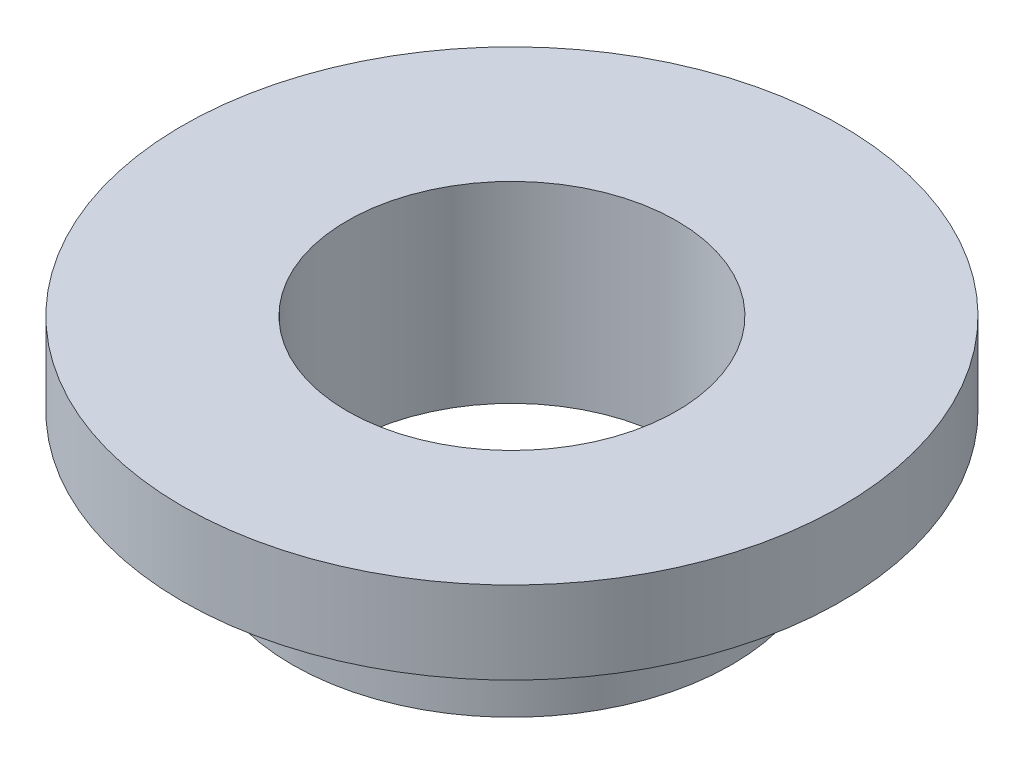
ISO-10303-21;
HEADER;
FILE_DESCRIPTION(('STEP AP214'),'2;1');
FILE_NAME('part.step','',(''),(''),'','','');
FILE_SCHEMA(('AUTOMOTIVE_DESIGN { 1 0 10303 214 1 1 1 1 }'));
ENDSEC;
DATA;
#1=APPLICATION_CONTEXT('core data for automotive mechanical design processes');
#2=APPLICATION_PROTOCOL_DEFINITION('international standard','automotive_design',2000,#1);
#3=PRODUCT_CONTEXT('',#1,'mechanical');
#4=PRODUCT('Part','Part','',(#3));
#5=PRODUCT_RELATED_PRODUCT_CATEGORY('part','',(#4));
#6=PRODUCT_DEFINITION_FORMATION('','',#4);
#7=PRODUCT_DEFINITION_CONTEXT('part definition',#1,'design');
#8=PRODUCT_DEFINITION('design','',#6,#7);
#9=PRODUCT_DEFINITION_SHAPE('','',#8);
#10=(LENGTH_UNIT() NAMED_UNIT(*) SI_UNIT(.MILLI.,.METRE.));
#11=(NAMED_UNIT(*) PLANE_ANGLE_UNIT() SI_UNIT($,.RADIAN.));
#12=(NAMED_UNIT(*) SI_UNIT($,.STERADIAN.) SOLID_ANGLE_UNIT());
#13=UNCERTAINTY_MEASURE_WITH_UNIT(LENGTH_MEASURE(1.E-05),#10,'distance_accuracy_value','');
#14=(GEOMETRIC_REPRESENTATION_CONTEXT(3) GLOBAL_UNCERTAINTY_ASSIGNED_CONTEXT((#13)) GLOBAL_UNIT_ASSIGNED_CONTEXT((#10,
#11,#12)) REPRESENTATION_CONTEXT('',''));
#15=CARTESIAN_POINT('',(0.,0.,0.));
#16=DIRECTION('',(0.,0.,1.));
#17=DIRECTION('',(1.,0.,0.));
#18=AXIS2_PLACEMENT_3D('',#15,#16,#17);
#19=CARTESIAN_POINT('',(0.,0.,0.));
#20=DIRECTION('',(0.,1.,0.));
#21=DIRECTION('',(0.,0.,1.));
#22=AXIS2_PLACEMENT_3D('',#19,#20,#21);
#23=PLANE('',#22);
#24=CARTESIAN_POINT('',(0.,0.,0.));
#25=DIRECTION('',(0.,1.,0.));
#26=DIRECTION('',(0.,0.,1.));
#27=AXIS2_PLACEMENT_3D('',#24,#25,#26);
#28=CIRCLE('',#27,8.);
#29=CARTESIAN_POINT('',(0.,0.,8.));
#30=VERTEX_POINT('',#29);
#31=EDGE_CURVE('E34',#30,#30,#28,.T.);
#32=ORIENTED_EDGE('',*,*,#31,.F.);
#33=EDGE_LOOP('',(#32));
#34=FACE_BOUND('',#33,.T.);
#35=CARTESIAN_POINT('',(0.,0.,0.));
#36=DIRECTION('',(0.,1.,0.));
#37=DIRECTION('',(0.,0.,1.));
#38=AXIS2_PLACEMENT_3D('',#35,#36,#37);
#39=CIRCLE('',#38,6.);
#40=CARTESIAN_POINT('',(0.,0.,6.));
#41=VERTEX_POINT('',#40);
#42=EDGE_CURVE('E41',#41,#41,#39,.T.);
#43=ORIENTED_EDGE('',*,*,#42,.T.);
#44=EDGE_LOOP('',(#43));
#45=FACE_BOUND('',#44,.T.);
#46=ADVANCED_FACE('F30',(#34,#45),#23,.F.);
#47=CARTESIAN_POINT('',(0.,4.,0.));
#48=DIRECTION('',(0.,-1.,0.));
#49=DIRECTION('',(0.,0.,-1.));
#50=AXIS2_PLACEMENT_3D('',#47,#48,#49);
#51=CYLINDRICAL_SURFACE('',#50,8.);
#52=CARTESIAN_POINT('',(0.,4.,0.));
#53=DIRECTION('',(0.,1.,0.));
#54=DIRECTION('',(0.,0.,1.));
#55=AXIS2_PLACEMENT_3D('',#52,#53,#54);
#56=CIRCLE('',#55,8.);
#57=CARTESIAN_POINT('',(0.,4.,8.));
#58=VERTEX_POINT('',#57);
#59=EDGE_CURVE('E10',#58,#58,#56,.T.);
#60=ORIENTED_EDGE('',*,*,#59,.F.);
#61=EDGE_LOOP('',(#60));
#62=FACE_BOUND('',#61,.T.);
#63=ORIENTED_EDGE('',*,*,#31,.T.);
#64=EDGE_LOOP('',(#63));
#65=FACE_BOUND('',#64,.T.);
#66=ADVANCED_FACE('F32',(#62,#65),#51,.T.);
#67=CARTESIAN_POINT('',(0.,4.,0.));
#68=DIRECTION('',(0.,-1.,0.));
#69=DIRECTION('',(0.,0.,-1.));
#70=AXIS2_PLACEMENT_3D('',#67,#68,#69);
#71=CYLINDRICAL_SURFACE('',#70,6.);
#72=ORIENTED_EDGE('',*,*,#42,.F.);
#73=EDGE_LOOP('',(#72));
#74=FACE_BOUND('',#73,.T.);
#75=CARTESIAN_POINT('',(0.,7.,0.));
#76=DIRECTION('',(0.,1.,0.));
#77=DIRECTION('',(0.,0.,1.));
#78=AXIS2_PLACEMENT_3D('',#75,#76,#77);
#79=CIRCLE('',#78,6.);
#80=CARTESIAN_POINT('',(0.,7.,6.));
#81=VERTEX_POINT('',#80);
#82=EDGE_CURVE('E49',#81,#81,#79,.T.);
#83=ORIENTED_EDGE('',*,*,#82,.T.);
#84=EDGE_LOOP('',(#83));
#85=FACE_BOUND('',#84,.T.);
#86=ADVANCED_FACE('F55',(#74,#85),#71,.F.);
#87=CARTESIAN_POINT('',(0.,4.,0.));
#88=DIRECTION('',(0.,1.,0.));
#89=DIRECTION('',(0.,0.,1.));
#90=AXIS2_PLACEMENT_3D('',#87,#88,#89);
#91=PLANE('',#90);
#92=CARTESIAN_POINT('',(0.,4.,0.));
#93=DIRECTION('',(0.,1.,0.));
#94=DIRECTION('',(0.,0.,1.));
#95=AXIS2_PLACEMENT_3D('',#92,#93,#94);
#96=CIRCLE('',#95,12.);
#97=CARTESIAN_POINT('',(0.,4.,12.));
#98=VERTEX_POINT('',#97);
#99=EDGE_CURVE('E46',#98,#98,#96,.T.);
#100=ORIENTED_EDGE('',*,*,#99,.F.);
#101=EDGE_LOOP('',(#100));
#102=FACE_BOUND('',#101,.T.);
#103=ORIENTED_EDGE('',*,*,#59,.T.);
#104=EDGE_LOOP('',(#103));
#105=FACE_BOUND('',#104,.T.);
#106=ADVANCED_FACE('F60',(#102,#105),#91,.F.);
#107=CARTESIAN_POINT('',(0.,7.,0.));
#108=DIRECTION('',(0.,1.,0.));
#109=DIRECTION('',(0.,0.,1.));
#110=AXIS2_PLACEMENT_3D('',#107,#108,#109);
#111=PLANE('',#110);
#112=CARTESIAN_POINT('',(0.,7.,0.));
#113=DIRECTION('',(0.,1.,0.));
#114=DIRECTION('',(0.,0.,1.));
#115=AXIS2_PLACEMENT_3D('',#112,#113,#114);
#116=CIRCLE('',#115,12.);
#117=CARTESIAN_POINT('',(0.,7.,12.));
#118=VERTEX_POINT('',#117);
#119=EDGE_CURVE('E45',#118,#118,#116,.T.);
#120=ORIENTED_EDGE('',*,*,#119,.T.);
#121=EDGE_LOOP('',(#120));
#122=FACE_BOUND('',#121,.T.);
#123=ORIENTED_EDGE('',*,*,#82,.F.);
#124=EDGE_LOOP('',(#123));
#125=FACE_BOUND('',#124,.T.);
#126=ADVANCED_FACE('F57',(#122,#125),#111,.T.);
#127=CARTESIAN_POINT('',(0.,7.,0.));
#128=DIRECTION('',(0.,-1.,0.));
#129=DIRECTION('',(0.,0.,-1.));
#130=AXIS2_PLACEMENT_3D('',#127,#128,#129);
#131=CYLINDRICAL_SURFACE('',#130,12.);
#132=ORIENTED_EDGE('',*,*,#119,.F.);
#133=EDGE_LOOP('',(#132));
#134=FACE_BOUND('',#133,.T.);
#135=ORIENTED_EDGE('',*,*,#99,.T.);
#136=EDGE_LOOP('',(#135));
#137=FACE_BOUND('',#136,.T.);
#138=ADVANCED_FACE('F59',(#134,#137),#131,.T.);
#139=CLOSED_SHELL('',(#46,#66,#86,#106,#126,#138));
#140=MANIFOLD_SOLID_BREP('B2',#139);
#141=ADVANCED_BREP_SHAPE_REPRESENTATION('',(#18,#140),#14);
#142=SHAPE_DEFINITION_REPRESENTATION(#9,#141);
ENDSEC;
END-ISO-10303-21;
